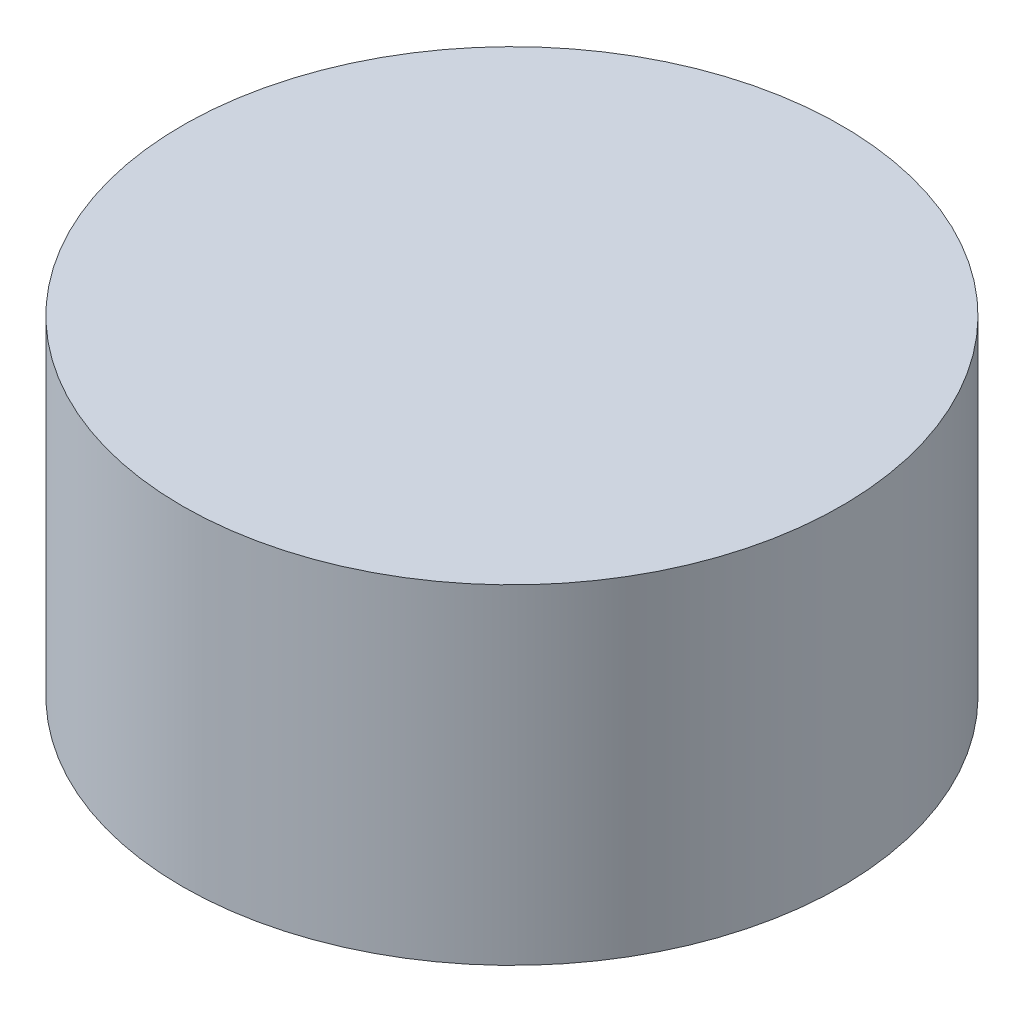
ISO-10303-21;
HEADER;
FILE_DESCRIPTION(('STEP AP214'),'2;1');
FILE_NAME('part.step','',(''),(''),'','','');
FILE_SCHEMA(('AUTOMOTIVE_DESIGN { 1 0 10303 214 1 1 1 1 }'));
ENDSEC;
DATA;
#1=APPLICATION_CONTEXT('core data for automotive mechanical design processes');
#2=APPLICATION_PROTOCOL_DEFINITION('international standard','automotive_design',2000,#1);
#3=PRODUCT_CONTEXT('',#1,'mechanical');
#4=PRODUCT('Part','Part','',(#3));
#5=PRODUCT_RELATED_PRODUCT_CATEGORY('part','',(#4));
#6=PRODUCT_DEFINITION_FORMATION('','',#4);
#7=PRODUCT_DEFINITION_CONTEXT('part definition',#1,'design');
#8=PRODUCT_DEFINITION('design','',#6,#7);
#9=PRODUCT_DEFINITION_SHAPE('','',#8);
#10=(LENGTH_UNIT() NAMED_UNIT(*) SI_UNIT(.MILLI.,.METRE.));
#11=(NAMED_UNIT(*) PLANE_ANGLE_UNIT() SI_UNIT($,.RADIAN.));
#12=(NAMED_UNIT(*) SI_UNIT($,.STERADIAN.) SOLID_ANGLE_UNIT());
#13=UNCERTAINTY_MEASURE_WITH_UNIT(LENGTH_MEASURE(1.E-05),#10,'distance_accuracy_value','');
#14=(GEOMETRIC_REPRESENTATION_CONTEXT(3) GLOBAL_UNCERTAINTY_ASSIGNED_CONTEXT((#13)) GLOBAL_UNIT_ASSIGNED_CONTEXT((#10,
#11,#12)) REPRESENTATION_CONTEXT('',''));
#15=CARTESIAN_POINT('',(0.,0.,0.));
#16=DIRECTION('',(0.,0.,1.));
#17=DIRECTION('',(1.,0.,0.));
#18=AXIS2_PLACEMENT_3D('',#15,#16,#17);
#19=CARTESIAN_POINT('',(0.,-1.73446726500611,0.));
#20=DIRECTION('',(0.,-1.,0.));
#21=DIRECTION('',(0.,0.,-1.));
#22=AXIS2_PLACEMENT_3D('',#19,#20,#21);
#23=PLANE('',#22);
#24=CARTESIAN_POINT('',(0.,-1.73446726500611,0.));
#25=DIRECTION('',(0.,1.,0.));
#26=DIRECTION('',(0.,0.,1.));
#27=AXIS2_PLACEMENT_3D('',#24,#25,#26);
#28=CIRCLE('',#27,0.5);
#29=CARTESIAN_POINT('',(0.,-1.73446726500611,0.5));
#30=VERTEX_POINT('',#29);
#31=EDGE_CURVE('E10',#30,#30,#28,.T.);
#32=ORIENTED_EDGE('',*,*,#31,.T.);
#33=EDGE_LOOP('',(#32));
#34=FACE_BOUND('',#33,.T.);
#35=ADVANCED_FACE('F34',(#34),#23,.F.);
#36=CARTESIAN_POINT('',(0.,0.774496621735186,0.));
#37=DIRECTION('',(0.,1.,0.));
#38=DIRECTION('',(0.,0.,1.));
#39=AXIS2_PLACEMENT_3D('',#36,#37,#38);
#40=CYLINDRICAL_SURFACE('',#39,0.5);
#41=ORIENTED_EDGE('',*,*,#31,.F.);
#42=EDGE_LOOP('',(#41));
#43=FACE_BOUND('',#42,.T.);
#44=CARTESIAN_POINT('',(0.,-2.23446726500611,0.));
#45=DIRECTION('',(0.,1.,0.));
#46=DIRECTION('',(0.,0.,1.));
#47=AXIS2_PLACEMENT_3D('',#44,#45,#46);
#48=CIRCLE('',#47,0.5);
#49=CARTESIAN_POINT('',(0.,-2.23446726500611,0.5));
#50=VERTEX_POINT('',#49);
#51=EDGE_CURVE('E41',#50,#50,#48,.T.);
#52=ORIENTED_EDGE('',*,*,#51,.T.);
#53=EDGE_LOOP('',(#52));
#54=FACE_BOUND('',#53,.T.);
#55=ADVANCED_FACE('F48',(#43,#54),#40,.T.);
#56=CARTESIAN_POINT('',(0.5,-2.23446726500611,0.));
#57=DIRECTION('',(0.,1.,0.));
#58=DIRECTION('',(0.,0.,1.));
#59=AXIS2_PLACEMENT_3D('',#56,#57,#58);
#60=PLANE('',#59);
#61=ORIENTED_EDGE('',*,*,#51,.F.);
#62=EDGE_LOOP('',(#61));
#63=FACE_BOUND('',#62,.T.);
#64=ADVANCED_FACE('F50',(#63),#60,.F.);
#65=CLOSED_SHELL('',(#35,#55,#64));
#66=MANIFOLD_SOLID_BREP('B2',#65);
#67=ADVANCED_BREP_SHAPE_REPRESENTATION('',(#18,#66),#14);
#68=SHAPE_DEFINITION_REPRESENTATION(#9,#67);
ENDSEC;
END-ISO-10303-21;
